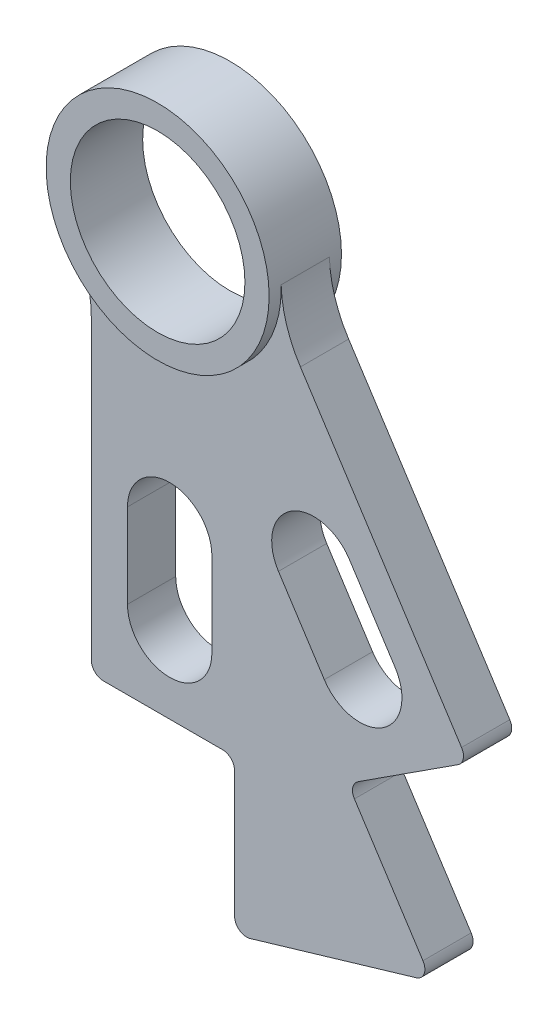
ISO-10303-21;
HEADER;
FILE_DESCRIPTION(('STEP AP214'),'2;1');
FILE_NAME('part.step','',(''),(''),'','','');
FILE_SCHEMA(('AUTOMOTIVE_DESIGN { 1 0 10303 214 1 1 1 1 }'));
ENDSEC;
DATA;
#1=APPLICATION_CONTEXT('core data for automotive mechanical design processes');
#2=APPLICATION_PROTOCOL_DEFINITION('international standard','automotive_design',2000,#1);
#3=PRODUCT_CONTEXT('',#1,'mechanical');
#4=PRODUCT('Part','Part','',(#3));
#5=PRODUCT_RELATED_PRODUCT_CATEGORY('part','',(#4));
#6=PRODUCT_DEFINITION_FORMATION('','',#4);
#7=PRODUCT_DEFINITION_CONTEXT('part definition',#1,'design');
#8=PRODUCT_DEFINITION('design','',#6,#7);
#9=PRODUCT_DEFINITION_SHAPE('','',#8);
#10=(LENGTH_UNIT() NAMED_UNIT(*) SI_UNIT(.MILLI.,.METRE.));
#11=(NAMED_UNIT(*) PLANE_ANGLE_UNIT() SI_UNIT($,.RADIAN.));
#12=(NAMED_UNIT(*) SI_UNIT($,.STERADIAN.) SOLID_ANGLE_UNIT());
#13=UNCERTAINTY_MEASURE_WITH_UNIT(LENGTH_MEASURE(1.E-05),#10,'distance_accuracy_value','');
#14=(GEOMETRIC_REPRESENTATION_CONTEXT(3) GLOBAL_UNCERTAINTY_ASSIGNED_CONTEXT((#13)) GLOBAL_UNIT_ASSIGNED_CONTEXT((#10,
#11,#12)) REPRESENTATION_CONTEXT('',''));
#15=CARTESIAN_POINT('',(0.,0.,0.));
#16=DIRECTION('',(0.,0.,1.));
#17=DIRECTION('',(1.,0.,0.));
#18=AXIS2_PLACEMENT_3D('',#15,#16,#17);
#19=CARTESIAN_POINT('',(0.,0.,4.7625));
#20=DIRECTION('',(0.,0.,-1.));
#21=DIRECTION('',(-1.,0.,0.));
#22=AXIS2_PLACEMENT_3D('',#19,#20,#21);
#23=CYLINDRICAL_SURFACE('',#22,11.495405);
#24=CARTESIAN_POINT('',(0.,0.,4.7625));
#25=DIRECTION('',(0.,0.,1.));
#26=DIRECTION('',(1.,0.,0.));
#27=AXIS2_PLACEMENT_3D('',#24,#25,#26);
#28=CIRCLE('',#27,11.495405);
#29=CARTESIAN_POINT('',(-11.495405,0.,4.7625));
#30=VERTEX_POINT('',#29);
#31=EDGE_CURVE('E337',#30,#30,#28,.T.);
#32=CARTESIAN_POINT('',(0.,0.,-4.7625));
#33=DIRECTION('',(0.,0.,1.));
#34=DIRECTION('',(1.,0.,0.));
#35=AXIS2_PLACEMENT_3D('',#32,#33,#34);
#36=CIRCLE('',#35,11.495405);
#37=CARTESIAN_POINT('',(-11.495405,0.,-4.7625));
#38=VERTEX_POINT('',#37);
#39=EDGE_CURVE('E325',#38,#38,#36,.T.);
#40=CARTESIAN_POINT('',(-11.495405,0.,4.7625));
#41=CARTESIAN_POINT('',(-11.495405,0.,4.66328125));
#42=CARTESIAN_POINT('',(-11.495405,0.,4.5640625));
#43=CARTESIAN_POINT('',(-11.495405,0.,4.365625));
#44=CARTESIAN_POINT('',(-11.495405,0.,4.26640625));
#45=CARTESIAN_POINT('',(-11.495405,0.,4.06796875));
#46=CARTESIAN_POINT('',(-11.495405,0.,3.96875));
#47=CARTESIAN_POINT('',(-11.495405,0.,3.7703125));
#48=CARTESIAN_POINT('',(-11.495405,0.,3.67109375));
#49=CARTESIAN_POINT('',(-11.495405,0.,3.47265625));
#50=CARTESIAN_POINT('',(-11.495405,0.,3.3734375));
#51=CARTESIAN_POINT('',(-11.495405,0.,3.175));
#52=CARTESIAN_POINT('',(-11.495405,0.,3.07578125));
#53=CARTESIAN_POINT('',(-11.495405,0.,2.87734375));
#54=CARTESIAN_POINT('',(-11.495405,0.,2.778125));
#55=CARTESIAN_POINT('',(-11.495405,0.,2.5796875));
#56=CARTESIAN_POINT('',(-11.495405,0.,2.48046875));
#57=CARTESIAN_POINT('',(-11.495405,0.,2.28203125));
#58=CARTESIAN_POINT('',(-11.495405,0.,2.1828125));
#59=CARTESIAN_POINT('',(-11.495405,0.,1.984375));
#60=CARTESIAN_POINT('',(-11.495405,0.,1.88515625));
#61=CARTESIAN_POINT('',(-11.495405,0.,1.68671875));
#62=CARTESIAN_POINT('',(-11.495405,0.,1.5875));
#63=CARTESIAN_POINT('',(-11.495405,0.,1.3890625));
#64=CARTESIAN_POINT('',(-11.495405,0.,1.28984375));
#65=CARTESIAN_POINT('',(-11.495405,0.,1.09140625));
#66=CARTESIAN_POINT('',(-11.495405,0.,0.992187499999999));
#67=CARTESIAN_POINT('',(-11.495405,0.,0.79375));
#68=CARTESIAN_POINT('',(-11.495405,0.,0.69453125));
#69=CARTESIAN_POINT('',(-11.495405,0.,0.49609375));
#70=CARTESIAN_POINT('',(-11.495405,0.,0.396875));
#71=CARTESIAN_POINT('',(-11.495405,0.,0.1984375));
#72=CARTESIAN_POINT('',(-11.495405,0.,0.0992187500000001));
#73=CARTESIAN_POINT('',(-11.495405,0.,-0.0992187500000001));
#74=CARTESIAN_POINT('',(-11.495405,0.,-0.1984375));
#75=CARTESIAN_POINT('',(-11.495405,0.,-0.396875));
#76=CARTESIAN_POINT('',(-11.495405,0.,-0.49609375));
#77=CARTESIAN_POINT('',(-11.495405,0.,-0.69453125));
#78=CARTESIAN_POINT('',(-11.495405,0.,-0.793750000000001));
#79=CARTESIAN_POINT('',(-11.495405,0.,-0.992187500000001));
#80=CARTESIAN_POINT('',(-11.495405,0.,-1.09140625));
#81=CARTESIAN_POINT('',(-11.495405,0.,-1.28984375));
#82=CARTESIAN_POINT('',(-11.495405,0.,-1.3890625));
#83=CARTESIAN_POINT('',(-11.495405,0.,-1.5875));
#84=CARTESIAN_POINT('',(-11.495405,0.,-1.68671875));
#85=CARTESIAN_POINT('',(-11.495405,0.,-1.88515625));
#86=CARTESIAN_POINT('',(-11.495405,0.,-1.984375));
#87=CARTESIAN_POINT('',(-11.495405,0.,-2.1828125));
#88=CARTESIAN_POINT('',(-11.495405,0.,-2.28203125));
#89=CARTESIAN_POINT('',(-11.495405,0.,-2.48046875));
#90=CARTESIAN_POINT('',(-11.495405,0.,-2.5796875));
#91=CARTESIAN_POINT('',(-11.495405,0.,-2.778125));
#92=CARTESIAN_POINT('',(-11.495405,0.,-2.87734375));
#93=CARTESIAN_POINT('',(-11.495405,0.,-3.07578125));
#94=CARTESIAN_POINT('',(-11.495405,0.,-3.175));
#95=CARTESIAN_POINT('',(-11.495405,0.,-3.3734375));
#96=CARTESIAN_POINT('',(-11.495405,0.,-3.47265625));
#97=CARTESIAN_POINT('',(-11.495405,0.,-3.67109375));
#98=CARTESIAN_POINT('',(-11.495405,0.,-3.7703125));
#99=CARTESIAN_POINT('',(-11.495405,0.,-3.96875));
#100=CARTESIAN_POINT('',(-11.495405,0.,-4.06796875));
#101=CARTESIAN_POINT('',(-11.495405,0.,-4.26640625));
#102=CARTESIAN_POINT('',(-11.495405,0.,-4.365625));
#103=CARTESIAN_POINT('',(-11.495405,0.,-4.5640625));
#104=CARTESIAN_POINT('',(-11.495405,0.,-4.66328125));
#105=CARTESIAN_POINT('',(-11.495405,0.,-4.7625));
#106=B_SPLINE_CURVE_WITH_KNOTS('',3,(#40,#41,#42,#43,#44,#45,#46,#47,#48,#49,#50,#51,#52,#53,
#54,#55,#56,#57,#58,#59,#60,#61,#62,#63,#64,#65,#66,#67,#68,#69,#70,#71,#72,#73,#74,#75,#76,#77,
#78,#79,#80,#81,#82,#83,#84,#85,#86,#87,#88,#89,#90,#91,#92,#93,#94,#95,#96,#97,#98,#99,#100,
#101,#102,#103,#104,#105),.UNSPECIFIED.,.F.,.F.,(4,2,2,2,2,2,2,2,2,2,2,2,2,2,2,2,2,2,2,2,2,2,2,
2,2,2,2,2,2,2,2,2,4),(0.,0.29765625,0.5953125,0.892968750000001,1.190625,1.48828125,1.7859375,
2.08359375,2.38125,2.67890625,2.9765625,3.27421875,3.571875,3.86953125,4.1671875,4.46484375,
4.7625,5.06015625,5.3578125,5.65546875,5.953125,6.25078125,6.5484375,6.84609375,7.14375,
7.44140625,7.7390625,8.03671875,8.334375,8.63203125,8.9296875,9.22734375,9.525),.UNSPECIFIED.);
#107=EDGE_CURVE('BSEAM35',#30,#38,#106,.T.);
#108=ORIENTED_EDGE('',*,*,#31,.T.);
#109=ORIENTED_EDGE('',*,*,#39,.F.);
#110=ORIENTED_EDGE('',*,*,#107,.T.);
#111=ORIENTED_EDGE('',*,*,#107,.F.);
#112=EDGE_LOOP('',(#108,#110,#109,#111));
#113=FACE_BOUND('',#112,.T.);
#114=ADVANCED_FACE('F35',(#113),#23,.F.);
#115=CARTESIAN_POINT('',(0.,0.,4.7625));
#116=DIRECTION('',(0.,0.,-1.));
#117=DIRECTION('',(-1.,0.,0.));
#118=AXIS2_PLACEMENT_3D('',#115,#116,#117);
#119=CYLINDRICAL_SURFACE('',#118,14.6812);
#120=DIRECTION('',(0.,0.,-1.));
#121=VECTOR('',#120,1.);
#122=CARTESIAN_POINT('',(-12.5851932668327,-7.5597978727258,3.175));
#123=LINE('',#122,#121);
#124=CARTESIAN_POINT('',(-12.5851932668327,-7.5597978727258,3.175));
#125=VERTEX_POINT('',#124);
#126=CARTESIAN_POINT('',(-12.5851932668327,-7.5597978727258,-3.175));
#127=VERTEX_POINT('',#126);
#128=EDGE_CURVE('E333',#125,#127,#123,.T.);
#129=ORIENTED_EDGE('',*,*,#128,.F.);
#130=CARTESIAN_POINT('',(0.,0.,3.175));
#131=DIRECTION('',(0.,0.,1.));
#132=DIRECTION('',(1.,0.,0.));
#133=AXIS2_PLACEMENT_3D('',#130,#131,#132);
#134=CIRCLE('',#133,14.6812);
#135=CARTESIAN_POINT('',(14.6729838648991,0.491098707400019,3.175));
#136=VERTEX_POINT('',#135);
#137=EDGE_CURVE('E225',#125,#136,#134,.T.);
#138=ORIENTED_EDGE('',*,*,#137,.T.);
#139=DIRECTION('',(0.,0.,-1.));
#140=VECTOR('',#139,1.);
#141=CARTESIAN_POINT('',(14.6729838648991,0.491098707400019,3.175));
#142=LINE('',#141,#140);
#143=CARTESIAN_POINT('',(14.6729838648991,0.491098707400019,-3.175));
#144=VERTEX_POINT('',#143);
#145=EDGE_CURVE('E222',#136,#144,#142,.T.);
#146=ORIENTED_EDGE('',*,*,#145,.T.);
#147=CARTESIAN_POINT('',(0.,0.,-3.175));
#148=DIRECTION('',(0.,0.,1.));
#149=DIRECTION('',(1.,0.,0.));
#150=AXIS2_PLACEMENT_3D('',#147,#148,#149);
#151=CIRCLE('',#150,14.6812);
#152=EDGE_CURVE('E274',#127,#144,#151,.T.);
#153=ORIENTED_EDGE('',*,*,#152,.F.);
#154=EDGE_LOOP('',(#129,#138,#146,#153));
#155=FACE_BOUND('',#154,.T.);
#156=CARTESIAN_POINT('',(0.,0.,4.7625));
#157=DIRECTION('',(0.,0.,1.));
#158=DIRECTION('',(1.,0.,0.));
#159=AXIS2_PLACEMENT_3D('',#156,#157,#158);
#160=CIRCLE('',#159,14.6812);
#161=CARTESIAN_POINT('',(14.6812,0.,4.7625));
#162=VERTEX_POINT('',#161);
#163=EDGE_CURVE('E340',#162,#162,#160,.T.);
#164=ORIENTED_EDGE('',*,*,#163,.F.);
#165=EDGE_LOOP('',(#164));
#166=FACE_BOUND('',#165,.T.);
#167=CARTESIAN_POINT('',(0.,0.,-4.7625));
#168=DIRECTION('',(0.,0.,1.));
#169=DIRECTION('',(1.,0.,0.));
#170=AXIS2_PLACEMENT_3D('',#167,#168,#169);
#171=CIRCLE('',#170,14.6812);
#172=CARTESIAN_POINT('',(14.6812,0.,-4.7625));
#173=VERTEX_POINT('',#172);
#174=EDGE_CURVE('E341',#173,#173,#171,.T.);
#175=ORIENTED_EDGE('',*,*,#174,.T.);
#176=EDGE_LOOP('',(#175));
#177=FACE_BOUND('',#176,.T.);
#178=ADVANCED_FACE('F438',(#155,#166,#177),#119,.T.);
#179=CARTESIAN_POINT('',(0.,0.,4.7625));
#180=DIRECTION('',(0.,0.,1.));
#181=DIRECTION('',(1.,0.,0.));
#182=AXIS2_PLACEMENT_3D('',#179,#180,#181);
#183=PLANE('',#182);
#184=ORIENTED_EDGE('',*,*,#31,.F.);
#185=EDGE_LOOP('',(#184));
#186=FACE_BOUND('',#185,.T.);
#187=ORIENTED_EDGE('',*,*,#163,.T.);
#188=EDGE_LOOP('',(#187));
#189=FACE_BOUND('',#188,.T.);
#190=ADVANCED_FACE('F463',(#186,#189),#183,.T.);
#191=CARTESIAN_POINT('',(0.,0.,-4.7625));
#192=DIRECTION('',(0.,0.,1.));
#193=DIRECTION('',(1.,0.,0.));
#194=AXIS2_PLACEMENT_3D('',#191,#192,#193);
#195=PLANE('',#194);
#196=ORIENTED_EDGE('',*,*,#39,.T.);
#197=EDGE_LOOP('',(#196));
#198=FACE_BOUND('',#197,.T.);
#199=ORIENTED_EDGE('',*,*,#174,.F.);
#200=EDGE_LOOP('',(#199));
#201=FACE_BOUND('',#200,.T.);
#202=ADVANCED_FACE('F672',(#198,#201),#195,.F.);
#203=CARTESIAN_POINT('',(0.,-34.9430697939241,3.175));
#204=DIRECTION('',(0.,0.,-1.));
#205=DIRECTION('',(-1.,0.,0.));
#206=AXIS2_PLACEMENT_3D('',#203,#204,#205);
#207=CYLINDRICAL_SURFACE('',#206,5.55625000000368);
#208=CARTESIAN_POINT('',(0.,-34.9430697939241,-3.175));
#209=DIRECTION('',(0.,0.,1.));
#210=DIRECTION('',(1.,0.,0.));
#211=AXIS2_PLACEMENT_3D('',#208,#209,#210);
#212=CIRCLE('',#211,5.55625000000368);
#213=CARTESIAN_POINT('',(5.55625000000371,-34.9430697939241,-3.175));
#214=VERTEX_POINT('',#213);
#215=CARTESIAN_POINT('',(-5.55625000000365,-34.9430697939241,-3.175));
#216=VERTEX_POINT('',#215);
#217=EDGE_CURVE('E303',#214,#216,#212,.T.);
#218=ORIENTED_EDGE('',*,*,#217,.F.);
#219=DIRECTION('',(0.,0.,-1.));
#220=VECTOR('',#219,1.);
#221=CARTESIAN_POINT('',(5.55625000000371,-34.9430697939241,3.175));
#222=LINE('',#221,#220);
#223=CARTESIAN_POINT('',(5.55625000000371,-34.9430697939241,3.175));
#224=VERTEX_POINT('',#223);
#225=EDGE_CURVE('E323',#224,#214,#222,.T.);
#226=ORIENTED_EDGE('',*,*,#225,.F.);
#227=CARTESIAN_POINT('',(0.,-34.9430697939241,3.175));
#228=DIRECTION('',(0.,0.,1.));
#229=DIRECTION('',(1.,0.,0.));
#230=AXIS2_PLACEMENT_3D('',#227,#228,#229);
#231=CIRCLE('',#230,5.55625000000368);
#232=CARTESIAN_POINT('',(-5.55625000000365,-34.9430697939241,3.175));
#233=VERTEX_POINT('',#232);
#234=EDGE_CURVE('E253',#224,#233,#231,.T.);
#235=ORIENTED_EDGE('',*,*,#234,.T.);
#236=DIRECTION('',(0.,0.,-1.));
#237=VECTOR('',#236,1.);
#238=CARTESIAN_POINT('',(-5.55625000000365,-34.9430697939241,3.175));
#239=LINE('',#238,#237);
#240=EDGE_CURVE('E316',#233,#216,#239,.T.);
#241=ORIENTED_EDGE('',*,*,#240,.T.);
#242=EDGE_LOOP('',(#218,#226,#235,#241));
#243=FACE_BOUND('',#242,.T.);
#244=ADVANCED_FACE('F662',(#243),#207,.F.);
#245=CARTESIAN_POINT('',(5.55625000000371,0.,3.175));
#246=DIRECTION('',(-1.,0.,0.));
#247=DIRECTION('',(0.,0.,1.));
#248=AXIS2_PLACEMENT_3D('',#245,#246,#247);
#249=PLANE('',#248);
#250=DIRECTION('',(0.,1.,0.));
#251=VECTOR('',#250,1.);
#252=CARTESIAN_POINT('',(5.55625000000371,0.,-3.175));
#253=LINE('',#252,#251);
#254=CARTESIAN_POINT('',(5.55625000000371,-46.0555697939241,-3.175));
#255=VERTEX_POINT('',#254);
#256=EDGE_CURVE('E306',#255,#214,#253,.T.);
#257=ORIENTED_EDGE('',*,*,#256,.F.);
#258=DIRECTION('',(0.,0.,-1.));
#259=VECTOR('',#258,1.);
#260=CARTESIAN_POINT('',(5.55625000000371,-46.0555697939241,3.175));
#261=LINE('',#260,#259);
#262=CARTESIAN_POINT('',(5.55625000000371,-46.0555697939241,3.175));
#263=VERTEX_POINT('',#262);
#264=EDGE_CURVE('E321',#263,#255,#261,.T.);
#265=ORIENTED_EDGE('',*,*,#264,.F.);
#266=DIRECTION('',(0.,1.,0.));
#267=VECTOR('',#266,1.);
#268=CARTESIAN_POINT('',(5.55625000000371,0.,3.175));
#269=LINE('',#268,#267);
#270=EDGE_CURVE('E256',#263,#224,#269,.T.);
#271=ORIENTED_EDGE('',*,*,#270,.T.);
#272=ORIENTED_EDGE('',*,*,#225,.T.);
#273=EDGE_LOOP('',(#257,#265,#271,#272));
#274=FACE_BOUND('',#273,.T.);
#275=ADVANCED_FACE('F652',(#274),#249,.T.);
#276=CARTESIAN_POINT('',(0.,-46.0555697939241,3.175));
#277=DIRECTION('',(0.,0.,-1.));
#278=DIRECTION('',(-1.,0.,0.));
#279=AXIS2_PLACEMENT_3D('',#276,#277,#278);
#280=CYLINDRICAL_SURFACE('',#279,5.55625000000368);
#281=CARTESIAN_POINT('',(0.,-46.0555697939241,-3.175));
#282=DIRECTION('',(0.,0.,1.));
#283=DIRECTION('',(1.,0.,0.));
#284=AXIS2_PLACEMENT_3D('',#281,#282,#283);
#285=CIRCLE('',#284,5.55625000000368);
#286=CARTESIAN_POINT('',(-5.55625000000365,-46.0555697939241,-3.175));
#287=VERTEX_POINT('',#286);
#288=EDGE_CURVE('E309',#287,#255,#285,.T.);
#289=ORIENTED_EDGE('',*,*,#288,.F.);
#290=DIRECTION('',(0.,0.,-1.));
#291=VECTOR('',#290,1.);
#292=CARTESIAN_POINT('',(-5.55625000000365,-46.0555697939241,3.175));
#293=LINE('',#292,#291);
#294=CARTESIAN_POINT('',(-5.55625000000365,-46.0555697939241,3.175));
#295=VERTEX_POINT('',#294);
#296=EDGE_CURVE('E318',#295,#287,#293,.T.);
#297=ORIENTED_EDGE('',*,*,#296,.F.);
#298=CARTESIAN_POINT('',(0.,-46.0555697939241,3.175));
#299=DIRECTION('',(0.,0.,1.));
#300=DIRECTION('',(1.,0.,0.));
#301=AXIS2_PLACEMENT_3D('',#298,#299,#300);
#302=CIRCLE('',#301,5.55625000000368);
#303=EDGE_CURVE('E259',#295,#263,#302,.T.);
#304=ORIENTED_EDGE('',*,*,#303,.T.);
#305=ORIENTED_EDGE('',*,*,#264,.T.);
#306=EDGE_LOOP('',(#289,#297,#304,#305));
#307=FACE_BOUND('',#306,.T.);
#308=ADVANCED_FACE('F642',(#307),#280,.F.);
#309=CARTESIAN_POINT('',(18.9851807063147,-29.3356615772007,3.175));
#310=DIRECTION('',(0.,0.,-1.));
#311=DIRECTION('',(-1.,0.,0.));
#312=AXIS2_PLACEMENT_3D('',#309,#310,#311);
#313=CYLINDRICAL_SURFACE('',#312,5.55625000000375);
#314=CARTESIAN_POINT('',(18.9851807063147,-29.3356615772007,-3.175));
#315=DIRECTION('',(0.,0.,1.));
#316=DIRECTION('',(1.,0.,0.));
#317=AXIS2_PLACEMENT_3D('',#314,#315,#316);
#318=CIRCLE('',#317,5.55625000000375);
#319=CARTESIAN_POINT('',(23.6498043527107,-26.3168538158445,-3.175));
#320=VERTEX_POINT('',#319);
#321=CARTESIAN_POINT('',(14.3205570599188,-32.3544693385572,-3.175));
#322=VERTEX_POINT('',#321);
#323=EDGE_CURVE('E291',#320,#322,#318,.T.);
#324=ORIENTED_EDGE('',*,*,#323,.F.);
#325=DIRECTION('',(0.,0.,-1.));
#326=VECTOR('',#325,1.);
#327=CARTESIAN_POINT('',(23.6498043527107,-26.3168538158445,3.175));
#328=LINE('',#327,#326);
#329=CARTESIAN_POINT('',(23.6498043527107,-26.3168538158445,3.175));
#330=VERTEX_POINT('',#329);
#331=EDGE_CURVE('E319',#330,#320,#328,.T.);
#332=ORIENTED_EDGE('',*,*,#331,.F.);
#333=CARTESIAN_POINT('',(18.9851807063147,-29.3356615772007,3.175));
#334=DIRECTION('',(0.,0.,1.));
#335=DIRECTION('',(1.,0.,0.));
#336=AXIS2_PLACEMENT_3D('',#333,#334,#335);
#337=CIRCLE('',#336,5.55625000000375);
#338=CARTESIAN_POINT('',(14.3205570599188,-32.3544693385572,3.175));
#339=VERTEX_POINT('',#338);
#340=EDGE_CURVE('E242',#330,#339,#337,.T.);
#341=ORIENTED_EDGE('',*,*,#340,.T.);
#342=DIRECTION('',(0.,0.,-1.));
#343=VECTOR('',#342,1.);
#344=CARTESIAN_POINT('',(14.3205570599188,-32.3544693385572,3.175));
#345=LINE('',#344,#343);
#346=EDGE_CURVE('E221',#339,#322,#345,.T.);
#347=ORIENTED_EDGE('',*,*,#346,.T.);
#348=EDGE_LOOP('',(#324,#332,#341,#347));
#349=FACE_BOUND('',#348,.T.);
#350=ADVANCED_FACE('F632',(#349),#313,.F.);
#351=CARTESIAN_POINT('',(4.66462364639593,3.0188077613563,3.175));
#352=DIRECTION('',(-0.839527315436279,-0.543317482358478,0.));
#353=DIRECTION('',(0.543317482358478,-0.839527315436279,0.));
#354=AXIS2_PLACEMENT_3D('',#351,#352,#353);
#355=PLANE('',#354);
#356=DIRECTION('',(-0.543317482358478,0.839527315436279,0.));
#357=VECTOR('',#356,1.);
#358=CARTESIAN_POINT('',(4.66462364639593,3.0188077613563,-3.175));
#359=LINE('',#358,#357);
#360=CARTESIAN_POINT('',(29.6874198754193,-35.6461011086302,-3.175));
#361=VERTEX_POINT('',#360);
#362=EDGE_CURVE('E294',#361,#320,#359,.T.);
#363=ORIENTED_EDGE('',*,*,#362,.F.);
#364=DIRECTION('',(0.,0.,-1.));
#365=VECTOR('',#364,1.);
#366=CARTESIAN_POINT('',(29.6874198754193,-35.6461011086302,3.175));
#367=LINE('',#366,#365);
#368=CARTESIAN_POINT('',(29.6874198754193,-35.6461011086302,3.175));
#369=VERTEX_POINT('',#368);
#370=EDGE_CURVE('E329',#369,#361,#367,.T.);
#371=ORIENTED_EDGE('',*,*,#370,.F.);
#372=DIRECTION('',(-0.543317482358478,0.839527315436279,0.));
#373=VECTOR('',#372,1.);
#374=CARTESIAN_POINT('',(4.66462364639593,3.0188077613563,3.175));
#375=LINE('',#374,#373);
#376=EDGE_CURVE('E245',#369,#330,#375,.T.);
#377=ORIENTED_EDGE('',*,*,#376,.T.);
#378=ORIENTED_EDGE('',*,*,#331,.T.);
#379=EDGE_LOOP('',(#363,#371,#377,#378));
#380=FACE_BOUND('',#379,.T.);
#381=ADVANCED_FACE('F622',(#380),#355,.T.);
#382=CARTESIAN_POINT('',(25.0227962290233,-38.6649088699864,3.175));
#383=DIRECTION('',(0.,0.,-1.));
#384=DIRECTION('',(-1.,0.,0.));
#385=AXIS2_PLACEMENT_3D('',#382,#383,#384);
#386=CYLINDRICAL_SURFACE('',#385,5.55625000000375);
#387=CARTESIAN_POINT('',(25.0227962290233,-38.6649088699864,-3.175));
#388=DIRECTION('',(0.,0.,1.));
#389=DIRECTION('',(1.,0.,0.));
#390=AXIS2_PLACEMENT_3D('',#387,#388,#389);
#391=CIRCLE('',#390,5.55625000000375);
#392=CARTESIAN_POINT('',(20.3581725826273,-41.6837166313428,-3.175));
#393=VERTEX_POINT('',#392);
#394=EDGE_CURVE('E297',#393,#361,#391,.T.);
#395=ORIENTED_EDGE('',*,*,#394,.F.);
#396=DIRECTION('',(0.,0.,-1.));
#397=VECTOR('',#396,1.);
#398=CARTESIAN_POINT('',(20.3581725826273,-41.6837166313428,3.175));
#399=LINE('',#398,#397);
#400=CARTESIAN_POINT('',(20.3581725826273,-41.6837166313428,3.175));
#401=VERTEX_POINT('',#400);
#402=EDGE_CURVE('E327',#401,#393,#399,.T.);
#403=ORIENTED_EDGE('',*,*,#402,.F.);
#404=CARTESIAN_POINT('',(25.0227962290233,-38.6649088699864,3.175));
#405=DIRECTION('',(0.,0.,1.));
#406=DIRECTION('',(1.,0.,0.));
#407=AXIS2_PLACEMENT_3D('',#404,#405,#406);
#408=CIRCLE('',#407,5.55625000000375);
#409=EDGE_CURVE('E248',#401,#369,#408,.T.);
#410=ORIENTED_EDGE('',*,*,#409,.T.);
#411=ORIENTED_EDGE('',*,*,#370,.T.);
#412=EDGE_LOOP('',(#395,#403,#410,#411));
#413=FACE_BOUND('',#412,.T.);
#414=ADVANCED_FACE('F588',(#413),#386,.F.);
#415=CARTESIAN_POINT('',(-7.17019291931249,-4.64033878745323,3.175));
#416=DIRECTION('',(0.839527315436278,0.543317482358478,0.));
#417=DIRECTION('',(-0.543317482358479,0.839527315436278,0.));
#418=AXIS2_PLACEMENT_3D('',#415,#416,#417);
#419=PLANE('',#418);
#420=DIRECTION('',(0.543317482358479,-0.839527315436278,0.));
#421=VECTOR('',#420,1.);
#422=CARTESIAN_POINT('',(-7.17019291931249,-4.64033878745323,3.175));
#423=LINE('',#422,#421);
#424=CARTESIAN_POINT('',(24.3214770840415,-53.3008697568528,3.175));
#425=VERTEX_POINT('',#424);
#426=CARTESIAN_POINT('',(33.3450702928547,-67.2440120781699,3.175));
#427=VERTEX_POINT('',#426);
#428=EDGE_CURVE('E315',#425,#427,#423,.T.);
#429=ORIENTED_EDGE('',*,*,#428,.T.);
#430=DIRECTION('',(0.,0.,-1.));
#431=VECTOR('',#430,1.);
#432=CARTESIAN_POINT('',(33.3450702928547,-67.2440120781699,-3.175));
#433=LINE('',#432,#431);
#434=CARTESIAN_POINT('',(33.3450702928547,-67.2440120781699,-3.175));
#435=VERTEX_POINT('',#434);
#436=EDGE_CURVE('E374',#427,#435,#433,.T.);
#437=ORIENTED_EDGE('',*,*,#436,.T.);
#438=DIRECTION('',(0.543317482358479,-0.839527315436278,0.));
#439=VECTOR('',#438,1.);
#440=CARTESIAN_POINT('',(-7.17019291931249,-4.64033878745323,-3.175));
#441=LINE('',#440,#439);
#442=CARTESIAN_POINT('',(24.3214770840415,-53.3008697568528,-3.175));
#443=VERTEX_POINT('',#442);
#444=EDGE_CURVE('E265',#443,#435,#441,.T.);
#445=ORIENTED_EDGE('',*,*,#444,.F.);
#446=DIRECTION('',(0.,0.,-1.));
#447=VECTOR('',#446,1.);
#448=CARTESIAN_POINT('',(24.3214770840415,-53.3008697568528,3.175));
#449=LINE('',#448,#447);
#450=EDGE_CURVE('E372',#443,#425,#449,.F.);
#451=ORIENTED_EDGE('',*,*,#450,.T.);
#452=EDGE_LOOP('',(#429,#437,#445,#451));
#453=FACE_BOUND('',#452,.T.);
#454=ADVANCED_FACE('F425',(#453),#419,.T.);
#455=CARTESIAN_POINT('',(30.6291535001097,-47.3277813561446,3.175));
#456=DIRECTION('',(-0.543317482358476,0.83952731543628,0.));
#457=DIRECTION('',(-0.83952731543628,-0.543317482358476,0.));
#458=AXIS2_PLACEMENT_3D('',#455,#456,#457);
#459=PLANE('',#458);
#460=DIRECTION('',(0.83952731543628,0.543317482358476,0.));
#461=VECTOR('',#460,1.);
#462=CARTESIAN_POINT('',(30.6291535001097,-47.3277813561446,3.175));
#463=LINE('',#462,#461);
#464=CARTESIAN_POINT('',(24.7917101940525,-51.1056036403536,3.175));
#465=VERTEX_POINT('',#464);
#466=CARTESIAN_POINT('',(37.9592763730128,-42.5839405883021,3.175));
#467=VERTEX_POINT('',#466);
#468=EDGE_CURVE('E211',#465,#467,#463,.T.);
#469=ORIENTED_EDGE('',*,*,#468,.F.);
#470=DIRECTION('',(0.,0.,-1.));
#471=VECTOR('',#470,1.);
#472=CARTESIAN_POINT('',(24.7917101940525,-51.1056036403536,3.175));
#473=LINE('',#472,#471);
#474=CARTESIAN_POINT('',(24.7917101940525,-51.1056036403536,-3.175));
#475=VERTEX_POINT('',#474);
#476=EDGE_CURVE('E379',#465,#475,#473,.T.);
#477=ORIENTED_EDGE('',*,*,#476,.T.);
#478=DIRECTION('',(0.83952731543628,0.543317482358476,0.));
#479=VECTOR('',#478,1.);
#480=CARTESIAN_POINT('',(30.6291535001097,-47.3277813561446,-3.175));
#481=LINE('',#480,#479);
#482=CARTESIAN_POINT('',(37.9592763730128,-42.5839405883021,-3.175));
#483=VERTEX_POINT('',#482);
#484=EDGE_CURVE('E268',#475,#483,#481,.T.);
#485=ORIENTED_EDGE('',*,*,#484,.T.);
#486=DIRECTION('',(0.,0.,-1.));
#487=VECTOR('',#486,1.);
#488=CARTESIAN_POINT('',(37.9592763730128,-42.5839405883021,3.175));
#489=LINE('',#488,#487);
#490=EDGE_CURVE('E377',#483,#467,#489,.F.);
#491=ORIENTED_EDGE('',*,*,#490,.T.);
#492=EDGE_LOOP('',(#469,#477,#485,#491));
#493=FACE_BOUND('',#492,.T.);
#494=ADVANCED_FACE('F569',(#493),#459,.F.);
#495=CARTESIAN_POINT('',(8.66287248615812,5.60635727108654,3.175));
#496=DIRECTION('',(-0.839527315436279,-0.543317482358477,0.));
#497=DIRECTION('',(0.543317482358477,-0.83952731543628,0.));
#498=AXIS2_PLACEMENT_3D('',#495,#496,#497);
#499=PLANE('',#498);
#500=DIRECTION('',(-0.543317482358477,0.839527315436279,0.));
#501=VECTOR('',#500,1.);
#502=CARTESIAN_POINT('',(8.66287248615812,5.60635727108654,3.175));
#503=LINE('',#502,#501);
#504=CARTESIAN_POINT('',(38.4295094830239,-40.3886744718029,3.175));
#505=VERTEX_POINT('',#504);
#506=CARTESIAN_POINT('',(17.2116035032164,-7.60303398572287,3.175));
#507=VERTEX_POINT('',#506);
#508=EDGE_CURVE('E196',#505,#507,#503,.T.);
#509=ORIENTED_EDGE('',*,*,#508,.F.);
#510=DIRECTION('',(0.,0.,-1.));
#511=VECTOR('',#510,1.);
#512=CARTESIAN_POINT('',(38.4295094830238,-40.3886744718029,3.175));
#513=LINE('',#512,#511);
#514=CARTESIAN_POINT('',(38.4295094830239,-40.3886744718029,-3.175));
#515=VERTEX_POINT('',#514);
#516=EDGE_CURVE('E388',#505,#515,#513,.T.);
#517=ORIENTED_EDGE('',*,*,#516,.T.);
#518=DIRECTION('',(-0.543317482358477,0.839527315436279,0.));
#519=VECTOR('',#518,1.);
#520=CARTESIAN_POINT('',(8.66287248615812,5.60635727108654,-3.175));
#521=LINE('',#520,#519);
#522=CARTESIAN_POINT('',(17.2116035032164,-7.60303398572287,-3.175));
#523=VERTEX_POINT('',#522);
#524=EDGE_CURVE('E217',#515,#523,#521,.T.);
#525=ORIENTED_EDGE('',*,*,#524,.T.);
#526=DIRECTION('',(0.,0.,-1.));
#527=VECTOR('',#526,1.);
#528=CARTESIAN_POINT('',(17.2116035032164,-7.60303398572287,3.175));
#529=LINE('',#528,#527);
#530=EDGE_CURVE('E214',#507,#523,#529,.T.);
#531=ORIENTED_EDGE('',*,*,#530,.F.);
#532=EDGE_LOOP('',(#509,#517,#525,#531));
#533=FACE_BOUND('',#532,.T.);
#534=ADVANCED_FACE('F215',(#533),#499,.F.);
#535=CARTESIAN_POINT('',(30.5390996357642,1.02213104671653,3.175));
#536=DIRECTION('',(0.,0.,-1.));
#537=DIRECTION('',(-1.,0.,0.));
#538=AXIS2_PLACEMENT_3D('',#535,#536,#537);
#539=CYLINDRICAL_SURFACE('',#538,15.8749999999966);
#540=CARTESIAN_POINT('',(30.5390996357642,1.02213104671653,-3.175));
#541=DIRECTION('',(0.,0.,1.));
#542=DIRECTION('',(1.,0.,0.));
#543=AXIS2_PLACEMENT_3D('',#540,#541,#542);
#544=CIRCLE('',#543,15.8749999999966);
#545=EDGE_CURVE('E272',#523,#144,#544,.F.);
#546=ORIENTED_EDGE('',*,*,#545,.T.);
#547=ORIENTED_EDGE('',*,*,#145,.F.);
#548=CARTESIAN_POINT('',(30.5390996357642,1.02213104671653,3.175));
#549=DIRECTION('',(0.,0.,1.));
#550=DIRECTION('',(1.,0.,0.));
#551=AXIS2_PLACEMENT_3D('',#548,#549,#550);
#552=CIRCLE('',#551,15.8749999999966);
#553=EDGE_CURVE('E203',#507,#136,#552,.F.);
#554=ORIENTED_EDGE('',*,*,#553,.F.);
#555=ORIENTED_EDGE('',*,*,#530,.T.);
#556=EDGE_LOOP('',(#546,#547,#554,#555));
#557=FACE_BOUND('',#556,.T.);
#558=ADVANCED_FACE('F224',(#557),#539,.F.);
#559=CARTESIAN_POINT('',(-26.1937499999966,-15.7343197939241,3.175));
#560=DIRECTION('',(0.,0.,-1.));
#561=DIRECTION('',(-1.,0.,0.));
#562=AXIS2_PLACEMENT_3D('',#559,#560,#561);
#563=CYLINDRICAL_SURFACE('',#562,15.8749999999966);
#564=CARTESIAN_POINT('',(-26.1937499999966,-15.7343197939241,-3.175));
#565=DIRECTION('',(0.,0.,1.));
#566=DIRECTION('',(1.,0.,0.));
#567=AXIS2_PLACEMENT_3D('',#564,#565,#566);
#568=CIRCLE('',#567,15.8749999999966);
#569=CARTESIAN_POINT('',(-10.31875,-15.7343197939241,-3.175));
#570=VERTEX_POINT('',#569);
#571=EDGE_CURVE('E277',#570,#127,#568,.T.);
#572=ORIENTED_EDGE('',*,*,#571,.F.);
#573=DIRECTION('',(0.,0.,-1.));
#574=VECTOR('',#573,1.);
#575=CARTESIAN_POINT('',(-10.31875,-15.7343197939241,3.175));
#576=LINE('',#575,#574);
#577=CARTESIAN_POINT('',(-10.31875,-15.7343197939241,3.175));
#578=VERTEX_POINT('',#577);
#579=EDGE_CURVE('E264',#578,#570,#576,.T.);
#580=ORIENTED_EDGE('',*,*,#579,.F.);
#581=CARTESIAN_POINT('',(-26.1937499999966,-15.7343197939241,3.175));
#582=DIRECTION('',(0.,0.,1.));
#583=DIRECTION('',(1.,0.,0.));
#584=AXIS2_PLACEMENT_3D('',#581,#582,#583);
#585=CIRCLE('',#584,15.8749999999966);
#586=EDGE_CURVE('E227',#578,#125,#585,.T.);
#587=ORIENTED_EDGE('',*,*,#586,.T.);
#588=ORIENTED_EDGE('',*,*,#128,.T.);
#589=EDGE_LOOP('',(#572,#580,#587,#588));
#590=FACE_BOUND('',#589,.T.);
#591=ADVANCED_FACE('F441',(#590),#563,.F.);
#592=CARTESIAN_POINT('',(-10.31875,0.,3.175));
#593=DIRECTION('',(1.,0.,0.));
#594=DIRECTION('',(0.,0.,-1.));
#595=AXIS2_PLACEMENT_3D('',#592,#593,#594);
#596=PLANE('',#595);
#597=DIRECTION('',(0.,-1.,0.));
#598=VECTOR('',#597,1.);
#599=CARTESIAN_POINT('',(-10.31875,0.,-3.175));
#600=LINE('',#599,#598);
#601=CARTESIAN_POINT('',(-10.31875,-54.7868197939241,-3.175));
#602=VERTEX_POINT('',#601);
#603=EDGE_CURVE('E280',#570,#602,#600,.T.);
#604=ORIENTED_EDGE('',*,*,#603,.T.);
#605=DIRECTION('',(0.,0.,-1.));
#606=VECTOR('',#605,1.);
#607=CARTESIAN_POINT('',(-10.31875,-54.7868197939241,3.175));
#608=LINE('',#607,#606);
#609=CARTESIAN_POINT('',(-10.31875,-54.7868197939241,3.175));
#610=VERTEX_POINT('',#609);
#611=EDGE_CURVE('E386',#602,#610,#608,.F.);
#612=ORIENTED_EDGE('',*,*,#611,.T.);
#613=DIRECTION('',(0.,-1.,0.));
#614=VECTOR('',#613,1.);
#615=CARTESIAN_POINT('',(-10.31875,0.,3.175));
#616=LINE('',#615,#614);
#617=EDGE_CURVE('E233',#578,#610,#616,.T.);
#618=ORIENTED_EDGE('',*,*,#617,.F.);
#619=ORIENTED_EDGE('',*,*,#579,.T.);
#620=EDGE_LOOP('',(#604,#612,#618,#619));
#621=FACE_BOUND('',#620,.T.);
#622=ADVANCED_FACE('F448',(#621),#596,.F.);
#623=CARTESIAN_POINT('',(-2.65364309406162E-13,-56.3743197939242,3.175));
#624=DIRECTION('',(0.,1.,0.));
#625=DIRECTION('',(-1.,0.,0.));
#626=AXIS2_PLACEMENT_3D('',#623,#624,#625);
#627=PLANE('',#626);
#628=DIRECTION('',(1.,0.,0.));
#629=VECTOR('',#628,1.);
#630=CARTESIAN_POINT('',(-2.65364309406162E-13,-56.3743197939242,-3.175));
#631=LINE('',#630,#629);
#632=CARTESIAN_POINT('',(-8.73124999999998,-56.3743197939241,-3.175));
#633=VERTEX_POINT('',#632);
#634=CARTESIAN_POINT('',(6.95325000000004,-56.3743197939242,-3.175));
#635=VERTEX_POINT('',#634);
#636=EDGE_CURVE('E283',#633,#635,#631,.T.);
#637=ORIENTED_EDGE('',*,*,#636,.T.);
#638=DIRECTION('',(0.,0.,-1.));
#639=VECTOR('',#638,1.);
#640=CARTESIAN_POINT('',(6.95325000000004,-56.3743197939242,3.175));
#641=LINE('',#640,#639);
#642=CARTESIAN_POINT('',(6.95325000000004,-56.3743197939242,3.175));
#643=VERTEX_POINT('',#642);
#644=EDGE_CURVE('E50',#635,#643,#641,.F.);
#645=ORIENTED_EDGE('',*,*,#644,.T.);
#646=DIRECTION('',(1.,0.,0.));
#647=VECTOR('',#646,1.);
#648=CARTESIAN_POINT('',(-2.65364309406162E-13,-56.3743197939242,3.175));
#649=LINE('',#648,#647);
#650=CARTESIAN_POINT('',(-8.73124999999998,-56.3743197939241,3.175));
#651=VERTEX_POINT('',#650);
#652=EDGE_CURVE('E235',#651,#643,#649,.T.);
#653=ORIENTED_EDGE('',*,*,#652,.F.);
#654=DIRECTION('',(0.,0.,-1.));
#655=VECTOR('',#654,1.);
#656=CARTESIAN_POINT('',(-8.73124999999998,-56.3743197939241,3.175));
#657=LINE('',#656,#655);
#658=EDGE_CURVE('E382',#651,#633,#657,.T.);
#659=ORIENTED_EDGE('',*,*,#658,.T.);
#660=EDGE_LOOP('',(#637,#645,#653,#659));
#661=FACE_BOUND('',#660,.T.);
#662=ADVANCED_FACE('F401',(#661),#627,.F.);
#663=CARTESIAN_POINT('',(8.54075000000004,0.,3.175));
#664=DIRECTION('',(1.,0.,0.));
#665=DIRECTION('',(0.,1.,0.));
#666=AXIS2_PLACEMENT_3D('',#663,#664,#665);
#667=PLANE('',#666);
#668=DIRECTION('',(0.,-1.,0.));
#669=VECTOR('',#668,1.);
#670=CARTESIAN_POINT('',(8.54075000000004,0.,-3.175));
#671=LINE('',#670,#669);
#672=CARTESIAN_POINT('',(8.54075000000003,-57.9618197939242,-3.175));
#673=VERTEX_POINT('',#672);
#674=CARTESIAN_POINT('',(8.54075000000003,-74.5701445797258,-3.175));
#675=VERTEX_POINT('',#674);
#676=EDGE_CURVE('E285',#673,#675,#671,.T.);
#677=ORIENTED_EDGE('',*,*,#676,.T.);
#678=DIRECTION('',(0.,0.,-1.));
#679=VECTOR('',#678,1.);
#680=CARTESIAN_POINT('',(8.54075000000003,-74.5701445797258,3.175));
#681=LINE('',#680,#679);
#682=CARTESIAN_POINT('',(8.54075000000003,-74.5701445797258,3.175));
#683=VERTEX_POINT('',#682);
#684=EDGE_CURVE('E364',#675,#683,#681,.F.);
#685=ORIENTED_EDGE('',*,*,#684,.T.);
#686=DIRECTION('',(0.,-1.,0.));
#687=VECTOR('',#686,1.);
#688=CARTESIAN_POINT('',(8.54075000000004,0.,3.175));
#689=LINE('',#688,#687);
#690=CARTESIAN_POINT('',(8.54075000000003,-57.9618197939242,3.175));
#691=VERTEX_POINT('',#690);
#692=EDGE_CURVE('E237',#691,#683,#689,.T.);
#693=ORIENTED_EDGE('',*,*,#692,.F.);
#694=DIRECTION('',(0.,0.,-1.));
#695=VECTOR('',#694,1.);
#696=CARTESIAN_POINT('',(8.54075000000003,-57.9618197939242,-3.175));
#697=LINE('',#696,#695);
#698=EDGE_CURVE('E361',#691,#673,#697,.T.);
#699=ORIENTED_EDGE('',*,*,#698,.T.);
#700=EDGE_LOOP('',(#677,#685,#693,#699));
#701=FACE_BOUND('',#700,.T.);
#702=ADVANCED_FACE('F408',(#701),#667,.F.);
#703=CARTESIAN_POINT('',(-4.66462364639603,-3.01880776135636,3.175));
#704=DIRECTION('',(-0.839527315436279,-0.543317482358478,0.));
#705=DIRECTION('',(0.543317482358478,-0.839527315436279,0.));
#706=AXIS2_PLACEMENT_3D('',#703,#704,#705);
#707=PLANE('',#706);
#708=DIRECTION('',(-0.543317482358478,0.839527315436279,0.));
#709=VECTOR('',#708,1.);
#710=CARTESIAN_POINT('',(-4.66462364639603,-3.01880776135636,-3.175));
#711=LINE('',#710,#709);
#712=EDGE_CURVE('E300',#393,#322,#711,.T.);
#713=ORIENTED_EDGE('',*,*,#712,.T.);
#714=ORIENTED_EDGE('',*,*,#346,.F.);
#715=DIRECTION('',(-0.543317482358478,0.839527315436279,0.));
#716=VECTOR('',#715,1.);
#717=CARTESIAN_POINT('',(-4.66462364639603,-3.01880776135636,3.175));
#718=LINE('',#717,#716);
#719=EDGE_CURVE('E251',#401,#339,#718,.T.);
#720=ORIENTED_EDGE('',*,*,#719,.F.);
#721=ORIENTED_EDGE('',*,*,#402,.T.);
#722=EDGE_LOOP('',(#713,#714,#720,#721));
#723=FACE_BOUND('',#722,.T.);
#724=ADVANCED_FACE('F539',(#723),#707,.F.);
#725=CARTESIAN_POINT('',(21.5199609111444,-72.8608174935983,3.175));
#726=DIRECTION('',(-0.28326020243187,0.959043094818088,0.));
#727=DIRECTION('',(-0.959043094818088,-0.28326020243187,0.));
#728=AXIS2_PLACEMENT_3D('',#725,#726,#727);
#729=PLANE('',#728);
#730=DIRECTION('',(0.959043094818088,0.28326020243187,0.));
#731=VECTOR('',#730,1.);
#732=CARTESIAN_POINT('',(21.5199609111444,-72.8608174935983,3.175));
#733=LINE('',#732,#731);
#734=CARTESIAN_POINT('',(10.5779255713606,-76.0926254927495,3.175));
#735=VERTEX_POINT('',#734);
#736=CARTESIAN_POINT('',(32.4619962509602,-69.6290094944377,3.175));
#737=VERTEX_POINT('',#736);
#738=EDGE_CURVE('E239',#735,#737,#733,.T.);
#739=ORIENTED_EDGE('',*,*,#738,.F.);
#740=DIRECTION('',(0.,0.,-1.));
#741=VECTOR('',#740,1.);
#742=CARTESIAN_POINT('',(10.5779255713606,-76.0926254927495,3.175));
#743=LINE('',#742,#741);
#744=CARTESIAN_POINT('',(10.5779255713606,-76.0926254927495,-3.175));
#745=VERTEX_POINT('',#744);
#746=EDGE_CURVE('E350',#735,#745,#743,.T.);
#747=ORIENTED_EDGE('',*,*,#746,.T.);
#748=DIRECTION('',(0.959043094818088,0.28326020243187,0.));
#749=VECTOR('',#748,1.);
#750=CARTESIAN_POINT('',(21.5199609111444,-72.8608174935983,-3.175));
#751=LINE('',#750,#749);
#752=CARTESIAN_POINT('',(32.4619962509602,-69.6290094944377,-3.175));
#753=VERTEX_POINT('',#752);
#754=EDGE_CURVE('E288',#745,#753,#751,.T.);
#755=ORIENTED_EDGE('',*,*,#754,.T.);
#756=DIRECTION('',(0.,0.,-1.));
#757=VECTOR('',#756,1.);
#758=CARTESIAN_POINT('',(32.4619962509602,-69.6290094944377,3.175));
#759=LINE('',#758,#757);
#760=EDGE_CURVE('E344',#753,#737,#759,.F.);
#761=ORIENTED_EDGE('',*,*,#760,.T.);
#762=EDGE_LOOP('',(#739,#747,#755,#761));
#763=FACE_BOUND('',#762,.T.);
#764=ADVANCED_FACE('F416',(#763),#729,.F.);
#765=CARTESIAN_POINT('',(-5.55625000000365,0.,3.175));
#766=DIRECTION('',(-1.,0.,0.));
#767=DIRECTION('',(0.,0.,1.));
#768=AXIS2_PLACEMENT_3D('',#765,#766,#767);
#769=PLANE('',#768);
#770=DIRECTION('',(0.,1.,0.));
#771=VECTOR('',#770,1.);
#772=CARTESIAN_POINT('',(-5.55625000000365,0.,-3.175));
#773=LINE('',#772,#771);
#774=EDGE_CURVE('E312',#287,#216,#773,.T.);
#775=ORIENTED_EDGE('',*,*,#774,.T.);
#776=ORIENTED_EDGE('',*,*,#240,.F.);
#777=DIRECTION('',(0.,1.,0.));
#778=VECTOR('',#777,1.);
#779=CARTESIAN_POINT('',(-5.55625000000365,0.,3.175));
#780=LINE('',#779,#778);
#781=EDGE_CURVE('E262',#295,#233,#780,.T.);
#782=ORIENTED_EDGE('',*,*,#781,.F.);
#783=ORIENTED_EDGE('',*,*,#296,.T.);
#784=EDGE_LOOP('',(#775,#776,#782,#783));
#785=FACE_BOUND('',#784,.T.);
#786=ADVANCED_FACE('F528',(#785),#769,.F.);
#787=CARTESIAN_POINT('',(0.,0.,3.175));
#788=DIRECTION('',(0.,0.,1.));
#789=DIRECTION('',(1.,0.,0.));
#790=AXIS2_PLACEMENT_3D('',#787,#788,#789);
#791=PLANE('',#790);
#792=ORIENTED_EDGE('',*,*,#692,.T.);
#793=CARTESIAN_POINT('',(10.12825,-74.5701445797258,3.175));
#794=DIRECTION('',(0.,0.,1.));
#795=DIRECTION('',(1.,0.,0.));
#796=AXIS2_PLACEMENT_3D('',#793,#794,#795);
#797=CIRCLE('',#796,1.5875);
#798=EDGE_CURVE('E370',#683,#735,#797,.T.);
#799=ORIENTED_EDGE('',*,*,#798,.T.);
#800=ORIENTED_EDGE('',*,*,#738,.T.);
#801=CARTESIAN_POINT('',(32.0123206795996,-68.106528581414,3.175));
#802=DIRECTION('',(0.,0.,1.));
#803=DIRECTION('',(1.,0.,0.));
#804=AXIS2_PLACEMENT_3D('',#801,#802,#803);
#805=CIRCLE('',#804,1.5875);
#806=EDGE_CURVE('E368',#737,#427,#805,.T.);
#807=ORIENTED_EDGE('',*,*,#806,.T.);
#808=ORIENTED_EDGE('',*,*,#428,.F.);
#809=CARTESIAN_POINT('',(25.6542266972966,-52.4383532536087,3.175));
#810=DIRECTION('',(0.,0.,1.));
#811=DIRECTION('',(1.,0.,0.));
#812=AXIS2_PLACEMENT_3D('',#809,#810,#811);
#813=CIRCLE('',#812,1.5875);
#814=EDGE_CURVE('E392',#425,#465,#813,.F.);
#815=ORIENTED_EDGE('',*,*,#814,.T.);
#816=ORIENTED_EDGE('',*,*,#468,.T.);
#817=CARTESIAN_POINT('',(37.0967598697688,-41.251190975047,3.175));
#818=DIRECTION('',(0.,0.,1.));
#819=DIRECTION('',(1.,0.,0.));
#820=AXIS2_PLACEMENT_3D('',#817,#818,#819);
#821=CIRCLE('',#820,1.5875);
#822=EDGE_CURVE('E207',#467,#505,#821,.T.);
#823=ORIENTED_EDGE('',*,*,#822,.T.);
#824=ORIENTED_EDGE('',*,*,#508,.T.);
#825=ORIENTED_EDGE('',*,*,#553,.T.);
#826=ORIENTED_EDGE('',*,*,#137,.F.);
#827=ORIENTED_EDGE('',*,*,#586,.F.);
#828=ORIENTED_EDGE('',*,*,#617,.T.);
#829=CARTESIAN_POINT('',(-8.73124999999997,-54.7868197939241,3.175));
#830=DIRECTION('',(0.,0.,1.));
#831=DIRECTION('',(1.,0.,0.));
#832=AXIS2_PLACEMENT_3D('',#829,#830,#831);
#833=CIRCLE('',#832,1.5875);
#834=EDGE_CURVE('E57',#610,#651,#833,.T.);
#835=ORIENTED_EDGE('',*,*,#834,.T.);
#836=ORIENTED_EDGE('',*,*,#652,.T.);
#837=CARTESIAN_POINT('',(6.95325000000003,-57.9618197939242,3.175));
#838=DIRECTION('',(0.,0.,1.));
#839=DIRECTION('',(1.,0.,0.));
#840=AXIS2_PLACEMENT_3D('',#837,#838,#839);
#841=CIRCLE('',#840,1.5875);
#842=EDGE_CURVE('E11',#643,#691,#841,.F.);
#843=ORIENTED_EDGE('',*,*,#842,.T.);
#844=EDGE_LOOP('',(#792,#799,#800,#807,#808,#815,#816,#823,#824,#825,#826,#827,#828,#835,#836,#843));
#845=FACE_BOUND('',#844,.T.);
#846=ORIENTED_EDGE('',*,*,#340,.F.);
#847=ORIENTED_EDGE('',*,*,#376,.F.);
#848=ORIENTED_EDGE('',*,*,#409,.F.);
#849=ORIENTED_EDGE('',*,*,#719,.T.);
#850=EDGE_LOOP('',(#846,#847,#848,#849));
#851=FACE_BOUND('',#850,.T.);
#852=ORIENTED_EDGE('',*,*,#234,.F.);
#853=ORIENTED_EDGE('',*,*,#270,.F.);
#854=ORIENTED_EDGE('',*,*,#303,.F.);
#855=ORIENTED_EDGE('',*,*,#781,.T.);
#856=EDGE_LOOP('',(#852,#853,#854,#855));
#857=FACE_BOUND('',#856,.T.);
#858=ADVANCED_FACE('F199',(#845,#851,#857),#791,.T.);
#859=CARTESIAN_POINT('',(0.,0.,-3.175));
#860=DIRECTION('',(0.,0.,1.));
#861=DIRECTION('',(1.,0.,0.));
#862=AXIS2_PLACEMENT_3D('',#859,#860,#861);
#863=PLANE('',#862);
#864=ORIENTED_EDGE('',*,*,#754,.F.);
#865=CARTESIAN_POINT('',(10.12825,-74.5701445797258,-3.175));
#866=DIRECTION('',(0.,0.,1.));
#867=DIRECTION('',(1.,0.,0.));
#868=AXIS2_PLACEMENT_3D('',#865,#866,#867);
#869=CIRCLE('',#868,1.5875);
#870=EDGE_CURVE('E359',#745,#675,#869,.F.);
#871=ORIENTED_EDGE('',*,*,#870,.T.);
#872=ORIENTED_EDGE('',*,*,#676,.F.);
#873=CARTESIAN_POINT('',(6.95325000000003,-57.9618197939242,-3.175));
#874=DIRECTION('',(0.,0.,1.));
#875=DIRECTION('',(1.,0.,0.));
#876=AXIS2_PLACEMENT_3D('',#873,#874,#875);
#877=CIRCLE('',#876,1.5875);
#878=EDGE_CURVE('E43',#673,#635,#877,.T.);
#879=ORIENTED_EDGE('',*,*,#878,.T.);
#880=ORIENTED_EDGE('',*,*,#636,.F.);
#881=CARTESIAN_POINT('',(-8.73124999999997,-54.7868197939241,-3.175));
#882=DIRECTION('',(0.,0.,1.));
#883=DIRECTION('',(1.,0.,0.));
#884=AXIS2_PLACEMENT_3D('',#881,#882,#883);
#885=CIRCLE('',#884,1.5875);
#886=EDGE_CURVE('E355',#633,#602,#885,.F.);
#887=ORIENTED_EDGE('',*,*,#886,.T.);
#888=ORIENTED_EDGE('',*,*,#603,.F.);
#889=ORIENTED_EDGE('',*,*,#571,.T.);
#890=ORIENTED_EDGE('',*,*,#152,.T.);
#891=ORIENTED_EDGE('',*,*,#545,.F.);
#892=ORIENTED_EDGE('',*,*,#524,.F.);
#893=CARTESIAN_POINT('',(37.0967598697688,-41.251190975047,-3.175));
#894=DIRECTION('',(0.,0.,1.));
#895=DIRECTION('',(1.,0.,0.));
#896=AXIS2_PLACEMENT_3D('',#893,#894,#895);
#897=CIRCLE('',#896,1.5875);
#898=EDGE_CURVE('E353',#515,#483,#897,.F.);
#899=ORIENTED_EDGE('',*,*,#898,.T.);
#900=ORIENTED_EDGE('',*,*,#484,.F.);
#901=CARTESIAN_POINT('',(25.6542266972966,-52.4383532536087,-3.175));
#902=DIRECTION('',(0.,0.,1.));
#903=DIRECTION('',(1.,0.,0.));
#904=AXIS2_PLACEMENT_3D('',#901,#902,#903);
#905=CIRCLE('',#904,1.5875);
#906=EDGE_CURVE('E390',#475,#443,#905,.T.);
#907=ORIENTED_EDGE('',*,*,#906,.T.);
#908=ORIENTED_EDGE('',*,*,#444,.T.);
#909=CARTESIAN_POINT('',(32.0123206795996,-68.106528581414,-3.175));
#910=DIRECTION('',(0.,0.,1.));
#911=DIRECTION('',(1.,0.,0.));
#912=AXIS2_PLACEMENT_3D('',#909,#910,#911);
#913=CIRCLE('',#912,1.5875);
#914=EDGE_CURVE('E357',#435,#753,#913,.F.);
#915=ORIENTED_EDGE('',*,*,#914,.T.);
#916=EDGE_LOOP('',(#864,#871,#872,#879,#880,#887,#888,#889,#890,#891,#892,#899,#900,#907,#908,#915));
#917=FACE_BOUND('',#916,.T.);
#918=ORIENTED_EDGE('',*,*,#323,.T.);
#919=ORIENTED_EDGE('',*,*,#712,.F.);
#920=ORIENTED_EDGE('',*,*,#394,.T.);
#921=ORIENTED_EDGE('',*,*,#362,.T.);
#922=EDGE_LOOP('',(#918,#919,#920,#921));
#923=FACE_BOUND('',#922,.T.);
#924=ORIENTED_EDGE('',*,*,#217,.T.);
#925=ORIENTED_EDGE('',*,*,#774,.F.);
#926=ORIENTED_EDGE('',*,*,#288,.T.);
#927=ORIENTED_EDGE('',*,*,#256,.T.);
#928=EDGE_LOOP('',(#924,#925,#926,#927));
#929=FACE_BOUND('',#928,.T.);
#930=ADVANCED_FACE('F397',(#917,#923,#929),#863,.F.);
#931=CARTESIAN_POINT('',(10.12825,-74.5701445797258,3.175));
#932=DIRECTION('',(0.,0.,-1.));
#933=DIRECTION('',(-1.,0.,0.));
#934=AXIS2_PLACEMENT_3D('',#931,#932,#933);
#935=CYLINDRICAL_SURFACE('',#934,1.5875);
#936=ORIENTED_EDGE('',*,*,#798,.F.);
#937=ORIENTED_EDGE('',*,*,#684,.F.);
#938=ORIENTED_EDGE('',*,*,#870,.F.);
#939=ORIENTED_EDGE('',*,*,#746,.F.);
#940=EDGE_LOOP('',(#936,#937,#938,#939));
#941=FACE_BOUND('',#940,.T.);
#942=ADVANCED_FACE('F411',(#941),#935,.T.);
#943=CARTESIAN_POINT('',(32.0123206795996,-68.106528581414,3.175));
#944=DIRECTION('',(0.,0.,1.));
#945=DIRECTION('',(1.,0.,0.));
#946=AXIS2_PLACEMENT_3D('',#943,#944,#945);
#947=CYLINDRICAL_SURFACE('',#946,1.5875);
#948=ORIENTED_EDGE('',*,*,#806,.F.);
#949=ORIENTED_EDGE('',*,*,#760,.F.);
#950=ORIENTED_EDGE('',*,*,#914,.F.);
#951=ORIENTED_EDGE('',*,*,#436,.F.);
#952=EDGE_LOOP('',(#948,#949,#950,#951));
#953=FACE_BOUND('',#952,.T.);
#954=ADVANCED_FACE('F419',(#953),#947,.T.);
#955=CARTESIAN_POINT('',(25.6542266972966,-52.4383532536087,3.175));
#956=DIRECTION('',(0.,0.,-1.));
#957=DIRECTION('',(-1.,0.,0.));
#958=AXIS2_PLACEMENT_3D('',#955,#956,#957);
#959=CYLINDRICAL_SURFACE('',#958,1.5875);
#960=ORIENTED_EDGE('',*,*,#814,.F.);
#961=ORIENTED_EDGE('',*,*,#450,.F.);
#962=ORIENTED_EDGE('',*,*,#906,.F.);
#963=ORIENTED_EDGE('',*,*,#476,.F.);
#964=EDGE_LOOP('',(#960,#961,#962,#963));
#965=FACE_BOUND('',#964,.T.);
#966=ADVANCED_FACE('F472',(#965),#959,.F.);
#967=CARTESIAN_POINT('',(6.95325000000003,-57.9618197939242,3.175));
#968=DIRECTION('',(0.,0.,1.));
#969=DIRECTION('',(1.,0.,0.));
#970=AXIS2_PLACEMENT_3D('',#967,#968,#969);
#971=CYLINDRICAL_SURFACE('',#970,1.5875);
#972=ORIENTED_EDGE('',*,*,#842,.F.);
#973=ORIENTED_EDGE('',*,*,#644,.F.);
#974=ORIENTED_EDGE('',*,*,#878,.F.);
#975=ORIENTED_EDGE('',*,*,#698,.F.);
#976=EDGE_LOOP('',(#972,#973,#974,#975));
#977=FACE_BOUND('',#976,.T.);
#978=ADVANCED_FACE('F404',(#977),#971,.F.);
#979=CARTESIAN_POINT('',(-8.73124999999997,-54.7868197939241,3.175));
#980=DIRECTION('',(0.,0.,-1.));
#981=DIRECTION('',(-1.,0.,0.));
#982=AXIS2_PLACEMENT_3D('',#979,#980,#981);
#983=CYLINDRICAL_SURFACE('',#982,1.5875);
#984=ORIENTED_EDGE('',*,*,#834,.F.);
#985=ORIENTED_EDGE('',*,*,#611,.F.);
#986=ORIENTED_EDGE('',*,*,#886,.F.);
#987=ORIENTED_EDGE('',*,*,#658,.F.);
#988=EDGE_LOOP('',(#984,#985,#986,#987));
#989=FACE_BOUND('',#988,.T.);
#990=ADVANCED_FACE('F447',(#989),#983,.T.);
#991=CARTESIAN_POINT('',(37.0967598697688,-41.251190975047,3.175));
#992=DIRECTION('',(0.,0.,-1.));
#993=DIRECTION('',(-1.,0.,0.));
#994=AXIS2_PLACEMENT_3D('',#991,#992,#993);
#995=CYLINDRICAL_SURFACE('',#994,1.5875);
#996=ORIENTED_EDGE('',*,*,#822,.F.);
#997=ORIENTED_EDGE('',*,*,#490,.F.);
#998=ORIENTED_EDGE('',*,*,#898,.F.);
#999=ORIENTED_EDGE('',*,*,#516,.F.);
#1000=EDGE_LOOP('',(#996,#997,#998,#999));
#1001=FACE_BOUND('',#1000,.T.);
#1002=ADVANCED_FACE('F37',(#1001),#995,.T.);
#1003=CLOSED_SHELL('',(#114,#178,#190,#202,#244,#275,#308,#350,#381,#414,#454,#494,#534,#558,
#591,#622,#662,#702,#724,#764,#786,#858,#930,#942,#954,#966,#978,#990,#1002));
#1004=MANIFOLD_SOLID_BREP('B2',#1003);
#1005=ADVANCED_BREP_SHAPE_REPRESENTATION('',(#18,#1004),#14);
#1006=SHAPE_DEFINITION_REPRESENTATION(#9,#1005);
ENDSEC;
END-ISO-10303-21;
